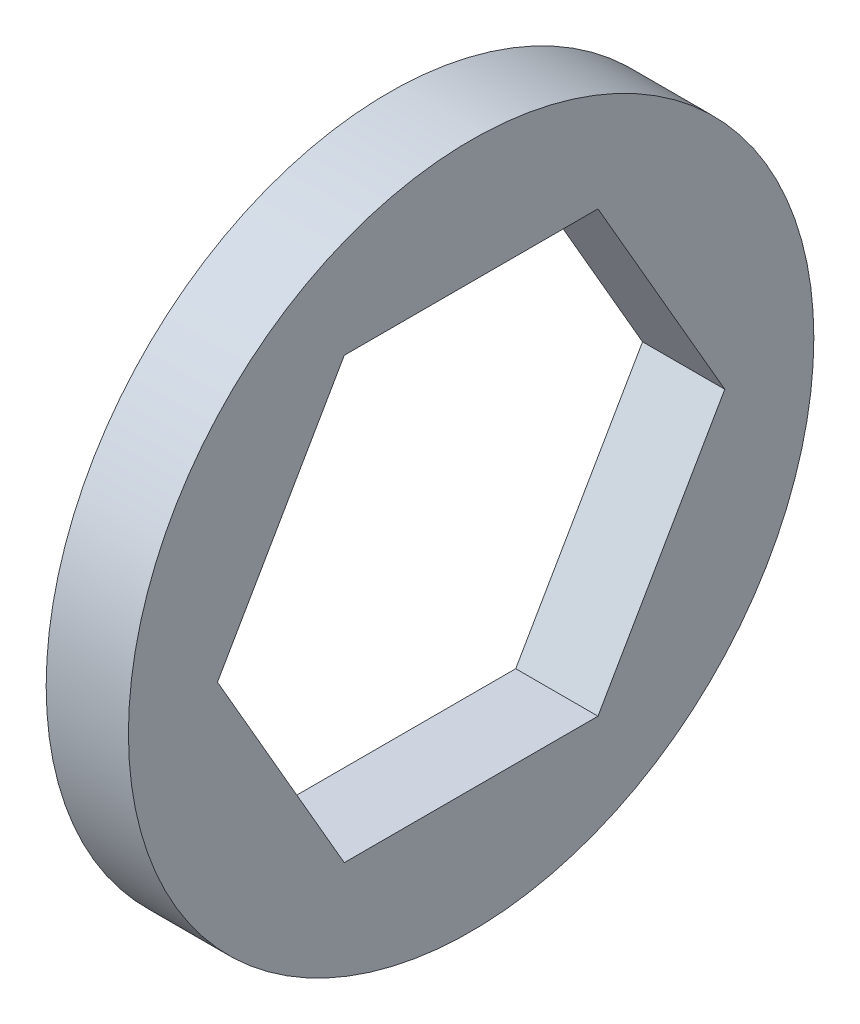
ISO-10303-21;
HEADER;
FILE_DESCRIPTION(('STEP AP214'),'2;1');
FILE_NAME('part.step','',(''),(''),'','','');
FILE_SCHEMA(('AUTOMOTIVE_DESIGN { 1 0 10303 214 1 1 1 1 }'));
ENDSEC;
DATA;
#1=APPLICATION_CONTEXT('core data for automotive mechanical design processes');
#2=APPLICATION_PROTOCOL_DEFINITION('international standard','automotive_design',2000,#1);
#3=PRODUCT_CONTEXT('',#1,'mechanical');
#4=PRODUCT('Part','Part','',(#3));
#5=PRODUCT_RELATED_PRODUCT_CATEGORY('part','',(#4));
#6=PRODUCT_DEFINITION_FORMATION('','',#4);
#7=PRODUCT_DEFINITION_CONTEXT('part definition',#1,'design');
#8=PRODUCT_DEFINITION('design','',#6,#7);
#9=PRODUCT_DEFINITION_SHAPE('','',#8);
#10=(LENGTH_UNIT() NAMED_UNIT(*) SI_UNIT(.MILLI.,.METRE.));
#11=(NAMED_UNIT(*) PLANE_ANGLE_UNIT() SI_UNIT($,.RADIAN.));
#12=(NAMED_UNIT(*) SI_UNIT($,.STERADIAN.) SOLID_ANGLE_UNIT());
#13=UNCERTAINTY_MEASURE_WITH_UNIT(LENGTH_MEASURE(1.E-05),#10,'distance_accuracy_value','');
#14=(GEOMETRIC_REPRESENTATION_CONTEXT(3) GLOBAL_UNCERTAINTY_ASSIGNED_CONTEXT((#13)) GLOBAL_UNIT_ASSIGNED_CONTEXT((#10,
#11,#12)) REPRESENTATION_CONTEXT('',''));
#15=CARTESIAN_POINT('',(0.,0.,0.));
#16=DIRECTION('',(0.,0.,1.));
#17=DIRECTION('',(1.,0.,0.));
#18=AXIS2_PLACEMENT_3D('',#15,#16,#17);
#19=CARTESIAN_POINT('',(6.,0.,0.));
#20=DIRECTION('',(1.,0.,0.));
#21=DIRECTION('',(0.,0.,-1.));
#22=AXIS2_PLACEMENT_3D('',#19,#20,#21);
#23=PLANE('',#22);
#24=CARTESIAN_POINT('',(6.,0.,0.));
#25=DIRECTION('',(1.,0.,0.));
#26=DIRECTION('',(0.,0.,-1.));
#27=AXIS2_PLACEMENT_3D('',#24,#25,#26);
#28=CIRCLE('',#27,25.);
#29=CARTESIAN_POINT('',(6.,0.,-25.));
#30=VERTEX_POINT('',#29);
#31=EDGE_CURVE('E11',#30,#30,#28,.T.);
#32=ORIENTED_EDGE('',*,*,#31,.T.);
#33=EDGE_LOOP('',(#32));
#34=FACE_BOUND('',#33,.T.);
#35=DIRECTION('',(0.,0.866025403784438,0.5));
#36=VECTOR('',#35,1.);
#37=CARTESIAN_POINT('',(6.,0.,-18.5040761275275));
#38=LINE('',#37,#36);
#39=CARTESIAN_POINT('',(6.,0.,-18.5040761275275));
#40=VERTEX_POINT('',#39);
#41=CARTESIAN_POINT('',(6.,16.025,-9.25203806376374));
#42=VERTEX_POINT('',#41);
#43=EDGE_CURVE('E94',#40,#42,#38,.T.);
#44=ORIENTED_EDGE('',*,*,#43,.F.);
#45=DIRECTION('',(0.,0.866025403784439,-0.5));
#46=VECTOR('',#45,1.);
#47=CARTESIAN_POINT('',(6.,-16.025,-9.25203806376375));
#48=LINE('',#47,#46);
#49=CARTESIAN_POINT('',(6.,-16.025,-9.25203806376375));
#50=VERTEX_POINT('',#49);
#51=EDGE_CURVE('E86',#50,#40,#48,.T.);
#52=ORIENTED_EDGE('',*,*,#51,.F.);
#53=DIRECTION('',(0.,0.,-1.));
#54=VECTOR('',#53,1.);
#55=CARTESIAN_POINT('',(6.,-16.025,9.25203806376375));
#56=LINE('',#55,#54);
#57=CARTESIAN_POINT('',(6.,-16.025,9.25203806376375));
#58=VERTEX_POINT('',#57);
#59=EDGE_CURVE('E114',#58,#50,#56,.T.);
#60=ORIENTED_EDGE('',*,*,#59,.F.);
#61=DIRECTION('',(0.,-0.866025403784439,-0.5));
#62=VECTOR('',#61,1.);
#63=CARTESIAN_POINT('',(6.,0.,18.5040761275275));
#64=LINE('',#63,#62);
#65=CARTESIAN_POINT('',(6.,0.,18.5040761275275));
#66=VERTEX_POINT('',#65);
#67=EDGE_CURVE('E112',#66,#58,#64,.T.);
#68=ORIENTED_EDGE('',*,*,#67,.F.);
#69=DIRECTION('',(0.,-0.866025403784439,0.5));
#70=VECTOR('',#69,1.);
#71=CARTESIAN_POINT('',(6.,16.025,9.25203806376375));
#72=LINE('',#71,#70);
#73=CARTESIAN_POINT('',(6.,16.025,9.25203806376375));
#74=VERTEX_POINT('',#73);
#75=EDGE_CURVE('E108',#74,#66,#72,.T.);
#76=ORIENTED_EDGE('',*,*,#75,.F.);
#77=DIRECTION('',(0.,0.,1.));
#78=VECTOR('',#77,1.);
#79=CARTESIAN_POINT('',(6.,16.025,-9.25203806376374));
#80=LINE('',#79,#78);
#81=EDGE_CURVE('E106',#42,#74,#80,.T.);
#82=ORIENTED_EDGE('',*,*,#81,.F.);
#83=EDGE_LOOP('',(#44,#52,#60,#68,#76,#82));
#84=FACE_BOUND('',#83,.T.);
#85=ADVANCED_FACE('F33',(#34,#84),#23,.T.);
#86=CARTESIAN_POINT('',(0.,0.,0.));
#87=DIRECTION('',(1.,0.,0.));
#88=DIRECTION('',(0.,0.,-1.));
#89=AXIS2_PLACEMENT_3D('',#86,#87,#88);
#90=PLANE('',#89);
#91=CARTESIAN_POINT('',(0.,0.,0.));
#92=DIRECTION('',(1.,0.,0.));
#93=DIRECTION('',(0.,0.,-1.));
#94=AXIS2_PLACEMENT_3D('',#91,#92,#93);
#95=CIRCLE('',#94,25.);
#96=CARTESIAN_POINT('',(0.,0.,-25.));
#97=VERTEX_POINT('',#96);
#98=EDGE_CURVE('E37',#97,#97,#95,.T.);
#99=ORIENTED_EDGE('',*,*,#98,.F.);
#100=EDGE_LOOP('',(#99));
#101=FACE_BOUND('',#100,.T.);
#102=DIRECTION('',(0.,0.866025403784439,-0.5));
#103=VECTOR('',#102,1.);
#104=CARTESIAN_POINT('',(0.,-16.025,-9.25203806376375));
#105=LINE('',#104,#103);
#106=CARTESIAN_POINT('',(0.,-16.025,-9.25203806376375));
#107=VERTEX_POINT('',#106);
#108=CARTESIAN_POINT('',(0.,0.,-18.5040761275275));
#109=VERTEX_POINT('',#108);
#110=EDGE_CURVE('E56',#107,#109,#105,.T.);
#111=ORIENTED_EDGE('',*,*,#110,.T.);
#112=DIRECTION('',(0.,0.866025403784438,0.5));
#113=VECTOR('',#112,1.);
#114=CARTESIAN_POINT('',(0.,0.,-18.5040761275275));
#115=LINE('',#114,#113);
#116=CARTESIAN_POINT('',(0.,16.025,-9.25203806376374));
#117=VERTEX_POINT('',#116);
#118=EDGE_CURVE('E101',#109,#117,#115,.T.);
#119=ORIENTED_EDGE('',*,*,#118,.T.);
#120=DIRECTION('',(0.,0.,1.));
#121=VECTOR('',#120,1.);
#122=CARTESIAN_POINT('',(0.,16.025,-9.25203806376374));
#123=LINE('',#122,#121);
#124=CARTESIAN_POINT('',(0.,16.025,9.25203806376375));
#125=VERTEX_POINT('',#124);
#126=EDGE_CURVE('E118',#117,#125,#123,.T.);
#127=ORIENTED_EDGE('',*,*,#126,.T.);
#128=DIRECTION('',(0.,-0.866025403784439,0.5));
#129=VECTOR('',#128,1.);
#130=CARTESIAN_POINT('',(0.,16.025,9.25203806376375));
#131=LINE('',#130,#129);
#132=CARTESIAN_POINT('',(0.,0.,18.5040761275275));
#133=VERTEX_POINT('',#132);
#134=EDGE_CURVE('E121',#125,#133,#131,.T.);
#135=ORIENTED_EDGE('',*,*,#134,.T.);
#136=DIRECTION('',(0.,-0.866025403784439,-0.5));
#137=VECTOR('',#136,1.);
#138=CARTESIAN_POINT('',(0.,0.,18.5040761275275));
#139=LINE('',#138,#137);
#140=CARTESIAN_POINT('',(0.,-16.025,9.25203806376375));
#141=VERTEX_POINT('',#140);
#142=EDGE_CURVE('E124',#133,#141,#139,.T.);
#143=ORIENTED_EDGE('',*,*,#142,.T.);
#144=DIRECTION('',(0.,0.,-1.));
#145=VECTOR('',#144,1.);
#146=CARTESIAN_POINT('',(0.,-16.025,9.25203806376375));
#147=LINE('',#146,#145);
#148=EDGE_CURVE('E95',#141,#107,#147,.T.);
#149=ORIENTED_EDGE('',*,*,#148,.T.);
#150=EDGE_LOOP('',(#111,#119,#127,#135,#143,#149));
#151=FACE_BOUND('',#150,.T.);
#152=ADVANCED_FACE('F141',(#101,#151),#90,.F.);
#153=CARTESIAN_POINT('',(6.,0.,0.));
#154=DIRECTION('',(-1.,0.,0.));
#155=DIRECTION('',(0.,0.,1.));
#156=AXIS2_PLACEMENT_3D('',#153,#154,#155);
#157=CYLINDRICAL_SURFACE('',#156,25.);
#158=ORIENTED_EDGE('',*,*,#31,.F.);
#159=EDGE_LOOP('',(#158));
#160=FACE_BOUND('',#159,.T.);
#161=ORIENTED_EDGE('',*,*,#98,.T.);
#162=EDGE_LOOP('',(#161));
#163=FACE_BOUND('',#162,.T.);
#164=ADVANCED_FACE('F35',(#160,#163),#157,.T.);
#165=CARTESIAN_POINT('',(6.,-16.025,-9.25203806376375));
#166=DIRECTION('',(0.,0.5,0.866025403784439));
#167=DIRECTION('',(0.,-0.866025403784439,0.5));
#168=AXIS2_PLACEMENT_3D('',#165,#166,#167);
#169=PLANE('',#168);
#170=ORIENTED_EDGE('',*,*,#110,.F.);
#171=DIRECTION('',(-1.,0.,0.));
#172=VECTOR('',#171,1.);
#173=CARTESIAN_POINT('',(6.,-16.025,-9.25203806376375));
#174=LINE('',#173,#172);
#175=EDGE_CURVE('E90',#50,#107,#174,.T.);
#176=ORIENTED_EDGE('',*,*,#175,.F.);
#177=ORIENTED_EDGE('',*,*,#51,.T.);
#178=DIRECTION('',(-1.,0.,0.));
#179=VECTOR('',#178,1.);
#180=CARTESIAN_POINT('',(6.,0.,-18.5040761275275));
#181=LINE('',#180,#179);
#182=EDGE_CURVE('E89',#40,#109,#181,.T.);
#183=ORIENTED_EDGE('',*,*,#182,.T.);
#184=EDGE_LOOP('',(#170,#176,#177,#183));
#185=FACE_BOUND('',#184,.T.);
#186=ADVANCED_FACE('F88',(#185),#169,.T.);
#187=CARTESIAN_POINT('',(6.,0.,-18.5040761275275));
#188=DIRECTION('',(0.,-0.5,0.866025403784439));
#189=DIRECTION('',(0.,-0.866025403784439,-0.5));
#190=AXIS2_PLACEMENT_3D('',#187,#188,#189);
#191=PLANE('',#190);
#192=ORIENTED_EDGE('',*,*,#118,.F.);
#193=ORIENTED_EDGE('',*,*,#182,.F.);
#194=ORIENTED_EDGE('',*,*,#43,.T.);
#195=DIRECTION('',(-1.,0.,0.));
#196=VECTOR('',#195,1.);
#197=CARTESIAN_POINT('',(6.,16.025,-9.25203806376374));
#198=LINE('',#197,#196);
#199=EDGE_CURVE('E102',#42,#117,#198,.T.);
#200=ORIENTED_EDGE('',*,*,#199,.T.);
#201=EDGE_LOOP('',(#192,#193,#194,#200));
#202=FACE_BOUND('',#201,.T.);
#203=ADVANCED_FACE('F98',(#202),#191,.T.);
#204=CARTESIAN_POINT('',(6.,16.025,-9.25203806376374));
#205=DIRECTION('',(0.,-1.,0.));
#206=DIRECTION('',(0.,0.,-1.));
#207=AXIS2_PLACEMENT_3D('',#204,#205,#206);
#208=PLANE('',#207);
#209=ORIENTED_EDGE('',*,*,#126,.F.);
#210=ORIENTED_EDGE('',*,*,#199,.F.);
#211=ORIENTED_EDGE('',*,*,#81,.T.);
#212=DIRECTION('',(-1.,0.,0.));
#213=VECTOR('',#212,1.);
#214=CARTESIAN_POINT('',(6.,16.025,9.25203806376375));
#215=LINE('',#214,#213);
#216=EDGE_CURVE('E133',#74,#125,#215,.T.);
#217=ORIENTED_EDGE('',*,*,#216,.T.);
#218=EDGE_LOOP('',(#209,#210,#211,#217));
#219=FACE_BOUND('',#218,.T.);
#220=ADVANCED_FACE('F137',(#219),#208,.T.);
#221=CARTESIAN_POINT('',(6.,16.025,9.25203806376375));
#222=DIRECTION('',(0.,-0.5,-0.866025403784438));
#223=DIRECTION('',(0.,0.866025403784439,-0.5));
#224=AXIS2_PLACEMENT_3D('',#221,#222,#223);
#225=PLANE('',#224);
#226=ORIENTED_EDGE('',*,*,#134,.F.);
#227=ORIENTED_EDGE('',*,*,#216,.F.);
#228=ORIENTED_EDGE('',*,*,#75,.T.);
#229=DIRECTION('',(-1.,0.,0.));
#230=VECTOR('',#229,1.);
#231=CARTESIAN_POINT('',(6.,0.,18.5040761275275));
#232=LINE('',#231,#230);
#233=EDGE_CURVE('E131',#66,#133,#232,.T.);
#234=ORIENTED_EDGE('',*,*,#233,.T.);
#235=EDGE_LOOP('',(#226,#227,#228,#234));
#236=FACE_BOUND('',#235,.T.);
#237=ADVANCED_FACE('F149',(#236),#225,.T.);
#238=CARTESIAN_POINT('',(6.,0.,18.5040761275275));
#239=DIRECTION('',(0.,0.5,-0.866025403784438));
#240=DIRECTION('',(0.,0.866025403784439,0.5));
#241=AXIS2_PLACEMENT_3D('',#238,#239,#240);
#242=PLANE('',#241);
#243=ORIENTED_EDGE('',*,*,#142,.F.);
#244=ORIENTED_EDGE('',*,*,#233,.F.);
#245=ORIENTED_EDGE('',*,*,#67,.T.);
#246=DIRECTION('',(-1.,0.,0.));
#247=VECTOR('',#246,1.);
#248=CARTESIAN_POINT('',(6.,-16.025,9.25203806376375));
#249=LINE('',#248,#247);
#250=EDGE_CURVE('E48',#58,#141,#249,.T.);
#251=ORIENTED_EDGE('',*,*,#250,.T.);
#252=EDGE_LOOP('',(#243,#244,#245,#251));
#253=FACE_BOUND('',#252,.T.);
#254=ADVANCED_FACE('F147',(#253),#242,.T.);
#255=CARTESIAN_POINT('',(6.,-16.025,9.25203806376375));
#256=DIRECTION('',(0.,1.,0.));
#257=DIRECTION('',(0.,0.,1.));
#258=AXIS2_PLACEMENT_3D('',#255,#256,#257);
#259=PLANE('',#258);
#260=ORIENTED_EDGE('',*,*,#148,.F.);
#261=ORIENTED_EDGE('',*,*,#250,.F.);
#262=ORIENTED_EDGE('',*,*,#59,.T.);
#263=ORIENTED_EDGE('',*,*,#175,.T.);
#264=EDGE_LOOP('',(#260,#261,#262,#263));
#265=FACE_BOUND('',#264,.T.);
#266=ADVANCED_FACE('F143',(#265),#259,.T.);
#267=CLOSED_SHELL('',(#85,#152,#164,#186,#203,#220,#237,#254,#266));
#268=MANIFOLD_SOLID_BREP('B2',#267);
#269=ADVANCED_BREP_SHAPE_REPRESENTATION('',(#18,#268),#14);
#270=SHAPE_DEFINITION_REPRESENTATION(#9,#269);
ENDSEC;
END-ISO-10303-21;
